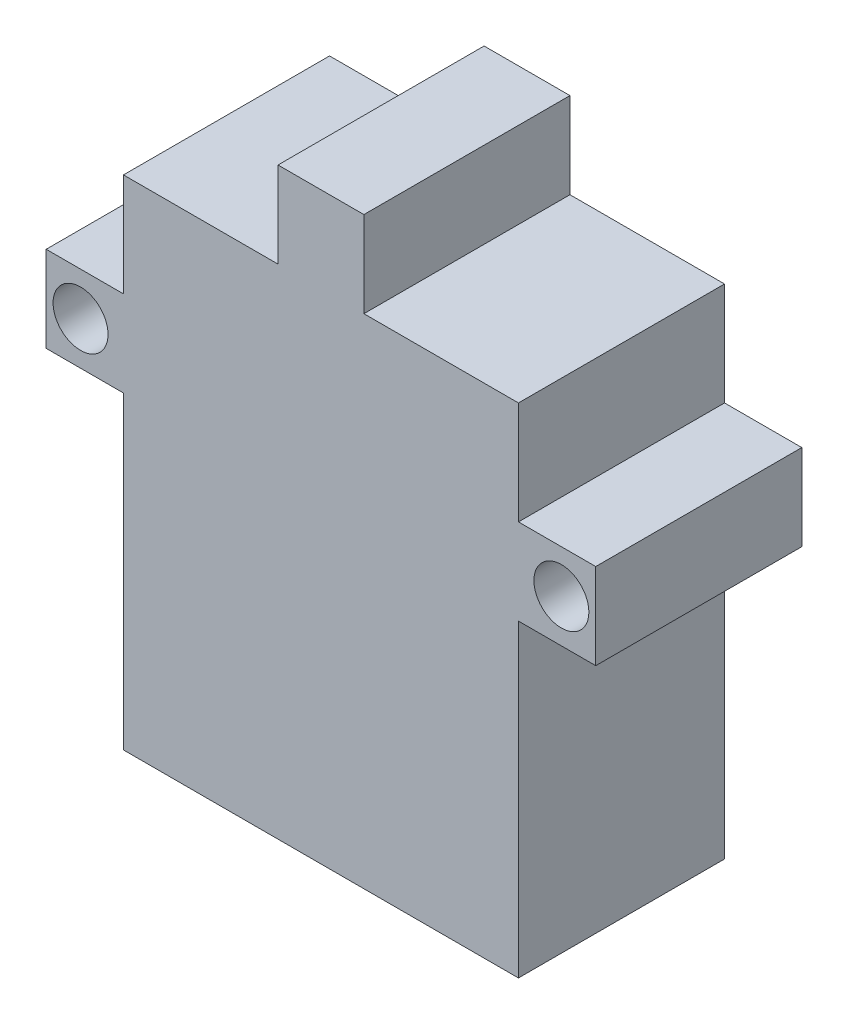
ISO-10303-21;
HEADER;
FILE_DESCRIPTION(('STEP AP214'),'2;1');
FILE_NAME('part.step','',(''),(''),'','','');
FILE_SCHEMA(('AUTOMOTIVE_DESIGN { 1 0 10303 214 1 1 1 1 }'));
ENDSEC;
DATA;
#1=APPLICATION_CONTEXT('core data for automotive mechanical design processes');
#2=APPLICATION_PROTOCOL_DEFINITION('international standard','automotive_design',2000,#1);
#3=PRODUCT_CONTEXT('',#1,'mechanical');
#4=PRODUCT('Part','Part','',(#3));
#5=PRODUCT_RELATED_PRODUCT_CATEGORY('part','',(#4));
#6=PRODUCT_DEFINITION_FORMATION('','',#4);
#7=PRODUCT_DEFINITION_CONTEXT('part definition',#1,'design');
#8=PRODUCT_DEFINITION('design','',#6,#7);
#9=PRODUCT_DEFINITION_SHAPE('','',#8);
#10=(LENGTH_UNIT() NAMED_UNIT(*) SI_UNIT(.MILLI.,.METRE.));
#11=(NAMED_UNIT(*) PLANE_ANGLE_UNIT() SI_UNIT($,.RADIAN.));
#12=(NAMED_UNIT(*) SI_UNIT($,.STERADIAN.) SOLID_ANGLE_UNIT());
#13=UNCERTAINTY_MEASURE_WITH_UNIT(LENGTH_MEASURE(1.E-05),#10,'distance_accuracy_value','');
#14=(GEOMETRIC_REPRESENTATION_CONTEXT(3) GLOBAL_UNCERTAINTY_ASSIGNED_CONTEXT((#13)) GLOBAL_UNIT_ASSIGNED_CONTEXT((#10,
#11,#12)) REPRESENTATION_CONTEXT('',''));
#15=CARTESIAN_POINT('',(0.,0.,0.));
#16=DIRECTION('',(0.,0.,1.));
#17=DIRECTION('',(1.,0.,0.));
#18=AXIS2_PLACEMENT_3D('',#15,#16,#17);
#19=CARTESIAN_POINT('',(0.,0.,6.));
#20=DIRECTION('',(0.,0.,1.));
#21=DIRECTION('',(1.,0.,0.));
#22=AXIS2_PLACEMENT_3D('',#19,#20,#21);
#23=PLANE('',#22);
#24=CARTESIAN_POINT('',(14.,20.5,6.));
#25=DIRECTION('',(0.,0.,1.));
#26=DIRECTION('',(1.,0.,0.));
#27=AXIS2_PLACEMENT_3D('',#24,#25,#26);
#28=CIRCLE('',#27,1.6);
#29=CARTESIAN_POINT('',(15.6,20.5,6.));
#30=VERTEX_POINT('',#29);
#31=EDGE_CURVE('E197',#30,#30,#28,.T.);
#32=ORIENTED_EDGE('',*,*,#31,.F.);
#33=EDGE_LOOP('',(#32));
#34=FACE_BOUND('',#33,.T.);
#35=DIRECTION('',(1.,0.,0.));
#36=VECTOR('',#35,1.);
#37=CARTESIAN_POINT('',(-11.5,0.,6.));
#38=LINE('',#37,#36);
#39=CARTESIAN_POINT('',(-11.5,0.,6.));
#40=VERTEX_POINT('',#39);
#41=CARTESIAN_POINT('',(11.5,0.,6.));
#42=VERTEX_POINT('',#41);
#43=EDGE_CURVE('E221',#40,#42,#38,.T.);
#44=ORIENTED_EDGE('',*,*,#43,.T.);
#45=DIRECTION('',(0.,1.,0.));
#46=VECTOR('',#45,1.);
#47=CARTESIAN_POINT('',(11.5,0.,6.));
#48=LINE('',#47,#46);
#49=CARTESIAN_POINT('',(11.5,18.,6.));
#50=VERTEX_POINT('',#49);
#51=EDGE_CURVE('E135',#42,#50,#48,.T.);
#52=ORIENTED_EDGE('',*,*,#51,.T.);
#53=DIRECTION('',(1.,0.,0.));
#54=VECTOR('',#53,1.);
#55=CARTESIAN_POINT('',(11.5,18.,6.));
#56=LINE('',#55,#54);
#57=CARTESIAN_POINT('',(16.,18.,6.));
#58=VERTEX_POINT('',#57);
#59=EDGE_CURVE('E263',#50,#58,#56,.T.);
#60=ORIENTED_EDGE('',*,*,#59,.T.);
#61=DIRECTION('',(0.,1.,0.));
#62=VECTOR('',#61,1.);
#63=CARTESIAN_POINT('',(16.,18.,6.));
#64=LINE('',#63,#62);
#65=CARTESIAN_POINT('',(16.,23.,6.));
#66=VERTEX_POINT('',#65);
#67=EDGE_CURVE('E285',#58,#66,#64,.T.);
#68=ORIENTED_EDGE('',*,*,#67,.T.);
#69=DIRECTION('',(-1.,0.,0.));
#70=VECTOR('',#69,1.);
#71=CARTESIAN_POINT('',(16.,23.,6.));
#72=LINE('',#71,#70);
#73=CARTESIAN_POINT('',(11.5,23.,6.));
#74=VERTEX_POINT('',#73);
#75=EDGE_CURVE('E276',#66,#74,#72,.T.);
#76=ORIENTED_EDGE('',*,*,#75,.T.);
#77=DIRECTION('',(0.,1.,0.));
#78=VECTOR('',#77,1.);
#79=CARTESIAN_POINT('',(11.5,23.,6.));
#80=LINE('',#79,#78);
#81=CARTESIAN_POINT('',(11.5,29.,6.));
#82=VERTEX_POINT('',#81);
#83=EDGE_CURVE('E283',#74,#82,#80,.T.);
#84=ORIENTED_EDGE('',*,*,#83,.T.);
#85=DIRECTION('',(-1.,0.,0.));
#86=VECTOR('',#85,1.);
#87=CARTESIAN_POINT('',(11.5,29.,6.));
#88=LINE('',#87,#86);
#89=CARTESIAN_POINT('',(2.5,29.,6.));
#90=VERTEX_POINT('',#89);
#91=EDGE_CURVE('E284',#82,#90,#88,.T.);
#92=ORIENTED_EDGE('',*,*,#91,.T.);
#93=DIRECTION('',(0.,1.,0.));
#94=VECTOR('',#93,1.);
#95=CARTESIAN_POINT('',(2.5,29.,6.));
#96=LINE('',#95,#94);
#97=CARTESIAN_POINT('',(2.5,34.,6.));
#98=VERTEX_POINT('',#97);
#99=EDGE_CURVE('E286',#90,#98,#96,.T.);
#100=ORIENTED_EDGE('',*,*,#99,.T.);
#101=DIRECTION('',(-1.,0.,0.));
#102=VECTOR('',#101,1.);
#103=CARTESIAN_POINT('',(2.5,34.,6.));
#104=LINE('',#103,#102);
#105=CARTESIAN_POINT('',(-2.5,34.,6.));
#106=VERTEX_POINT('',#105);
#107=EDGE_CURVE('E295',#98,#106,#104,.T.);
#108=ORIENTED_EDGE('',*,*,#107,.T.);
#109=DIRECTION('',(0.,-1.,0.));
#110=VECTOR('',#109,1.);
#111=CARTESIAN_POINT('',(-2.5,34.,6.));
#112=LINE('',#111,#110);
#113=CARTESIAN_POINT('',(-2.5,29.,6.));
#114=VERTEX_POINT('',#113);
#115=EDGE_CURVE('E294',#106,#114,#112,.T.);
#116=ORIENTED_EDGE('',*,*,#115,.T.);
#117=DIRECTION('',(-1.,0.,0.));
#118=VECTOR('',#117,1.);
#119=CARTESIAN_POINT('',(-2.5,29.,6.));
#120=LINE('',#119,#118);
#121=CARTESIAN_POINT('',(-11.5,29.,6.));
#122=VERTEX_POINT('',#121);
#123=EDGE_CURVE('E298',#114,#122,#120,.T.);
#124=ORIENTED_EDGE('',*,*,#123,.T.);
#125=DIRECTION('',(0.,-1.,0.));
#126=VECTOR('',#125,1.);
#127=CARTESIAN_POINT('',(-11.5,29.,6.));
#128=LINE('',#127,#126);
#129=CARTESIAN_POINT('',(-11.5,23.,6.));
#130=VERTEX_POINT('',#129);
#131=EDGE_CURVE('E296',#122,#130,#128,.T.);
#132=ORIENTED_EDGE('',*,*,#131,.T.);
#133=DIRECTION('',(-1.,0.,0.));
#134=VECTOR('',#133,1.);
#135=CARTESIAN_POINT('',(-11.5,23.,6.));
#136=LINE('',#135,#134);
#137=CARTESIAN_POINT('',(-16.,23.,6.));
#138=VERTEX_POINT('',#137);
#139=EDGE_CURVE('E172',#130,#138,#136,.T.);
#140=ORIENTED_EDGE('',*,*,#139,.T.);
#141=DIRECTION('',(0.,-1.,0.));
#142=VECTOR('',#141,1.);
#143=CARTESIAN_POINT('',(-16.,23.,6.));
#144=LINE('',#143,#142);
#145=CARTESIAN_POINT('',(-16.,18.,6.));
#146=VERTEX_POINT('',#145);
#147=EDGE_CURVE('E166',#138,#146,#144,.T.);
#148=ORIENTED_EDGE('',*,*,#147,.T.);
#149=DIRECTION('',(1.,0.,0.));
#150=VECTOR('',#149,1.);
#151=CARTESIAN_POINT('',(-16.,18.,6.));
#152=LINE('',#151,#150);
#153=CARTESIAN_POINT('',(-11.5,18.,6.));
#154=VERTEX_POINT('',#153);
#155=EDGE_CURVE('E171',#146,#154,#152,.T.);
#156=ORIENTED_EDGE('',*,*,#155,.T.);
#157=DIRECTION('',(0.,-1.,0.));
#158=VECTOR('',#157,1.);
#159=CARTESIAN_POINT('',(-11.5,18.,6.));
#160=LINE('',#159,#158);
#161=EDGE_CURVE('E62',#154,#40,#160,.T.);
#162=ORIENTED_EDGE('',*,*,#161,.T.);
#163=EDGE_LOOP('',(#44,#52,#60,#68,#76,#84,#92,#100,#108,#116,#124,#132,#140,#148,#156,#162));
#164=FACE_BOUND('',#163,.T.);
#165=CARTESIAN_POINT('',(-14.,20.5,6.));
#166=DIRECTION('',(0.,0.,1.));
#167=DIRECTION('',(1.,0.,0.));
#168=AXIS2_PLACEMENT_3D('',#165,#166,#167);
#169=CIRCLE('',#168,1.6);
#170=CARTESIAN_POINT('',(-12.4,20.5,6.));
#171=VERTEX_POINT('',#170);
#172=EDGE_CURVE('E374',#171,#171,#169,.T.);
#173=ORIENTED_EDGE('',*,*,#172,.F.);
#174=EDGE_LOOP('',(#173));
#175=FACE_BOUND('',#174,.T.);
#176=ADVANCED_FACE('F50',(#34,#164,#175),#23,.T.);
#177=CARTESIAN_POINT('',(0.,0.,-6.));
#178=DIRECTION('',(0.,0.,1.));
#179=DIRECTION('',(1.,0.,0.));
#180=AXIS2_PLACEMENT_3D('',#177,#178,#179);
#181=PLANE('',#180);
#182=DIRECTION('',(1.,0.,0.));
#183=VECTOR('',#182,1.);
#184=CARTESIAN_POINT('',(-11.5,0.,-6.));
#185=LINE('',#184,#183);
#186=CARTESIAN_POINT('',(-11.5,0.,-6.));
#187=VERTEX_POINT('',#186);
#188=CARTESIAN_POINT('',(11.5,0.,-6.));
#189=VERTEX_POINT('',#188);
#190=EDGE_CURVE('E193',#187,#189,#185,.T.);
#191=ORIENTED_EDGE('',*,*,#190,.F.);
#192=DIRECTION('',(0.,-1.,0.));
#193=VECTOR('',#192,1.);
#194=CARTESIAN_POINT('',(-11.5,18.,-6.));
#195=LINE('',#194,#193);
#196=CARTESIAN_POINT('',(-11.5,18.,-6.));
#197=VERTEX_POINT('',#196);
#198=EDGE_CURVE('E124',#197,#187,#195,.T.);
#199=ORIENTED_EDGE('',*,*,#198,.F.);
#200=DIRECTION('',(1.,0.,0.));
#201=VECTOR('',#200,1.);
#202=CARTESIAN_POINT('',(-16.,18.,-6.));
#203=LINE('',#202,#201);
#204=CARTESIAN_POINT('',(-16.,18.,-6.));
#205=VERTEX_POINT('',#204);
#206=EDGE_CURVE('E116',#205,#197,#203,.T.);
#207=ORIENTED_EDGE('',*,*,#206,.F.);
#208=DIRECTION('',(0.,-1.,0.));
#209=VECTOR('',#208,1.);
#210=CARTESIAN_POINT('',(-16.,23.,-6.));
#211=LINE('',#210,#209);
#212=CARTESIAN_POINT('',(-16.,23.,-6.));
#213=VERTEX_POINT('',#212);
#214=EDGE_CURVE('E181',#213,#205,#211,.T.);
#215=ORIENTED_EDGE('',*,*,#214,.F.);
#216=DIRECTION('',(-1.,0.,0.));
#217=VECTOR('',#216,1.);
#218=CARTESIAN_POINT('',(-11.5,23.,-6.));
#219=LINE('',#218,#217);
#220=CARTESIAN_POINT('',(-11.5,23.,-6.));
#221=VERTEX_POINT('',#220);
#222=EDGE_CURVE('E218',#221,#213,#219,.T.);
#223=ORIENTED_EDGE('',*,*,#222,.F.);
#224=DIRECTION('',(0.,-1.,0.));
#225=VECTOR('',#224,1.);
#226=CARTESIAN_POINT('',(-11.5,29.,-6.));
#227=LINE('',#226,#225);
#228=CARTESIAN_POINT('',(-11.5,29.,-6.));
#229=VERTEX_POINT('',#228);
#230=EDGE_CURVE('E220',#229,#221,#227,.T.);
#231=ORIENTED_EDGE('',*,*,#230,.F.);
#232=DIRECTION('',(-1.,0.,0.));
#233=VECTOR('',#232,1.);
#234=CARTESIAN_POINT('',(-2.5,29.,-6.));
#235=LINE('',#234,#233);
#236=CARTESIAN_POINT('',(-2.5,29.,-6.));
#237=VERTEX_POINT('',#236);
#238=EDGE_CURVE('E214',#237,#229,#235,.T.);
#239=ORIENTED_EDGE('',*,*,#238,.F.);
#240=DIRECTION('',(0.,-1.,0.));
#241=VECTOR('',#240,1.);
#242=CARTESIAN_POINT('',(-2.5,34.,-6.));
#243=LINE('',#242,#241);
#244=CARTESIAN_POINT('',(-2.5,34.,-6.));
#245=VERTEX_POINT('',#244);
#246=EDGE_CURVE('E213',#245,#237,#243,.T.);
#247=ORIENTED_EDGE('',*,*,#246,.F.);
#248=DIRECTION('',(-1.,0.,0.));
#249=VECTOR('',#248,1.);
#250=CARTESIAN_POINT('',(2.5,34.,-6.));
#251=LINE('',#250,#249);
#252=CARTESIAN_POINT('',(2.5,34.,-6.));
#253=VERTEX_POINT('',#252);
#254=EDGE_CURVE('E211',#253,#245,#251,.T.);
#255=ORIENTED_EDGE('',*,*,#254,.F.);
#256=DIRECTION('',(0.,1.,0.));
#257=VECTOR('',#256,1.);
#258=CARTESIAN_POINT('',(2.5,29.,-6.));
#259=LINE('',#258,#257);
#260=CARTESIAN_POINT('',(2.5,29.,-6.));
#261=VERTEX_POINT('',#260);
#262=EDGE_CURVE('E207',#261,#253,#259,.T.);
#263=ORIENTED_EDGE('',*,*,#262,.F.);
#264=DIRECTION('',(-1.,0.,0.));
#265=VECTOR('',#264,1.);
#266=CARTESIAN_POINT('',(11.5,29.,-6.));
#267=LINE('',#266,#265);
#268=CARTESIAN_POINT('',(11.5,29.,-6.));
#269=VERTEX_POINT('',#268);
#270=EDGE_CURVE('E210',#269,#261,#267,.T.);
#271=ORIENTED_EDGE('',*,*,#270,.F.);
#272=DIRECTION('',(0.,1.,0.));
#273=VECTOR('',#272,1.);
#274=CARTESIAN_POINT('',(11.5,23.,-6.));
#275=LINE('',#274,#273);
#276=CARTESIAN_POINT('',(11.5,23.,-6.));
#277=VERTEX_POINT('',#276);
#278=EDGE_CURVE('E202',#277,#269,#275,.T.);
#279=ORIENTED_EDGE('',*,*,#278,.F.);
#280=DIRECTION('',(-1.,0.,0.));
#281=VECTOR('',#280,1.);
#282=CARTESIAN_POINT('',(16.,23.,-6.));
#283=LINE('',#282,#281);
#284=CARTESIAN_POINT('',(16.,23.,-6.));
#285=VERTEX_POINT('',#284);
#286=EDGE_CURVE('E201',#285,#277,#283,.T.);
#287=ORIENTED_EDGE('',*,*,#286,.F.);
#288=DIRECTION('',(0.,1.,0.));
#289=VECTOR('',#288,1.);
#290=CARTESIAN_POINT('',(16.,18.,-6.));
#291=LINE('',#290,#289);
#292=CARTESIAN_POINT('',(16.,18.,-6.));
#293=VERTEX_POINT('',#292);
#294=EDGE_CURVE('E203',#293,#285,#291,.T.);
#295=ORIENTED_EDGE('',*,*,#294,.F.);
#296=DIRECTION('',(1.,0.,0.));
#297=VECTOR('',#296,1.);
#298=CARTESIAN_POINT('',(11.5,18.,-6.));
#299=LINE('',#298,#297);
#300=CARTESIAN_POINT('',(11.5,18.,-6.));
#301=VERTEX_POINT('',#300);
#302=EDGE_CURVE('E200',#301,#293,#299,.T.);
#303=ORIENTED_EDGE('',*,*,#302,.F.);
#304=DIRECTION('',(0.,1.,0.));
#305=VECTOR('',#304,1.);
#306=CARTESIAN_POINT('',(11.5,0.,-6.));
#307=LINE('',#306,#305);
#308=EDGE_CURVE('E198',#189,#301,#307,.T.);
#309=ORIENTED_EDGE('',*,*,#308,.F.);
#310=EDGE_LOOP('',(#191,#199,#207,#215,#223,#231,#239,#247,#255,#263,#271,#279,#287,#295,#303,#309));
#311=FACE_BOUND('',#310,.T.);
#312=CARTESIAN_POINT('',(14.,20.5,-6.));
#313=DIRECTION('',(0.,0.,1.));
#314=DIRECTION('',(1.,0.,0.));
#315=AXIS2_PLACEMENT_3D('',#312,#313,#314);
#316=CIRCLE('',#315,1.6);
#317=CARTESIAN_POINT('',(15.6,20.5,-6.));
#318=VERTEX_POINT('',#317);
#319=EDGE_CURVE('E381',#318,#318,#316,.T.);
#320=ORIENTED_EDGE('',*,*,#319,.T.);
#321=EDGE_LOOP('',(#320));
#322=FACE_BOUND('',#321,.T.);
#323=CARTESIAN_POINT('',(-14.,20.5,-6.));
#324=DIRECTION('',(0.,0.,1.));
#325=DIRECTION('',(1.,0.,0.));
#326=AXIS2_PLACEMENT_3D('',#323,#324,#325);
#327=CIRCLE('',#326,1.6);
#328=CARTESIAN_POINT('',(-12.4,20.5,-6.));
#329=VERTEX_POINT('',#328);
#330=EDGE_CURVE('E378',#329,#329,#327,.T.);
#331=ORIENTED_EDGE('',*,*,#330,.T.);
#332=EDGE_LOOP('',(#331));
#333=FACE_BOUND('',#332,.T.);
#334=ADVANCED_FACE('F270',(#311,#322,#333),#181,.F.);
#335=CARTESIAN_POINT('',(-11.5,0.,6.));
#336=DIRECTION('',(0.,1.,0.));
#337=DIRECTION('',(0.,0.,1.));
#338=AXIS2_PLACEMENT_3D('',#335,#336,#337);
#339=PLANE('',#338);
#340=ORIENTED_EDGE('',*,*,#190,.T.);
#341=DIRECTION('',(0.,0.,-1.));
#342=VECTOR('',#341,1.);
#343=CARTESIAN_POINT('',(11.5,0.,6.));
#344=LINE('',#343,#342);
#345=EDGE_CURVE('E11',#42,#189,#344,.T.);
#346=ORIENTED_EDGE('',*,*,#345,.F.);
#347=ORIENTED_EDGE('',*,*,#43,.F.);
#348=DIRECTION('',(0.,0.,-1.));
#349=VECTOR('',#348,1.);
#350=CARTESIAN_POINT('',(-11.5,0.,6.));
#351=LINE('',#350,#349);
#352=EDGE_CURVE('E189',#40,#187,#351,.T.);
#353=ORIENTED_EDGE('',*,*,#352,.T.);
#354=EDGE_LOOP('',(#340,#346,#347,#353));
#355=FACE_BOUND('',#354,.T.);
#356=ADVANCED_FACE('F49',(#355),#339,.F.);
#357=CARTESIAN_POINT('',(11.5,0.,6.));
#358=DIRECTION('',(-1.,0.,0.));
#359=DIRECTION('',(0.,0.,1.));
#360=AXIS2_PLACEMENT_3D('',#357,#358,#359);
#361=PLANE('',#360);
#362=ORIENTED_EDGE('',*,*,#308,.T.);
#363=DIRECTION('',(0.,0.,-1.));
#364=VECTOR('',#363,1.);
#365=CARTESIAN_POINT('',(11.5,18.,6.));
#366=LINE('',#365,#364);
#367=EDGE_CURVE('E60',#50,#301,#366,.T.);
#368=ORIENTED_EDGE('',*,*,#367,.F.);
#369=ORIENTED_EDGE('',*,*,#51,.F.);
#370=ORIENTED_EDGE('',*,*,#345,.T.);
#371=EDGE_LOOP('',(#362,#368,#369,#370));
#372=FACE_BOUND('',#371,.T.);
#373=ADVANCED_FACE('F340',(#372),#361,.F.);
#374=CARTESIAN_POINT('',(11.5,18.,6.));
#375=DIRECTION('',(0.,1.,0.));
#376=DIRECTION('',(0.,0.,1.));
#377=AXIS2_PLACEMENT_3D('',#374,#375,#376);
#378=PLANE('',#377);
#379=ORIENTED_EDGE('',*,*,#302,.T.);
#380=DIRECTION('',(0.,0.,-1.));
#381=VECTOR('',#380,1.);
#382=CARTESIAN_POINT('',(16.,18.,6.));
#383=LINE('',#382,#381);
#384=EDGE_CURVE('E254',#58,#293,#383,.T.);
#385=ORIENTED_EDGE('',*,*,#384,.F.);
#386=ORIENTED_EDGE('',*,*,#59,.F.);
#387=ORIENTED_EDGE('',*,*,#367,.T.);
#388=EDGE_LOOP('',(#379,#385,#386,#387));
#389=FACE_BOUND('',#388,.T.);
#390=ADVANCED_FACE('F261',(#389),#378,.F.);
#391=CARTESIAN_POINT('',(16.,18.,6.));
#392=DIRECTION('',(-1.,0.,0.));
#393=DIRECTION('',(0.,0.,1.));
#394=AXIS2_PLACEMENT_3D('',#391,#392,#393);
#395=PLANE('',#394);
#396=ORIENTED_EDGE('',*,*,#294,.T.);
#397=DIRECTION('',(0.,0.,-1.));
#398=VECTOR('',#397,1.);
#399=CARTESIAN_POINT('',(16.,23.,6.));
#400=LINE('',#399,#398);
#401=EDGE_CURVE('E252',#66,#285,#400,.T.);
#402=ORIENTED_EDGE('',*,*,#401,.F.);
#403=ORIENTED_EDGE('',*,*,#67,.F.);
#404=ORIENTED_EDGE('',*,*,#384,.T.);
#405=EDGE_LOOP('',(#396,#402,#403,#404));
#406=FACE_BOUND('',#405,.T.);
#407=ADVANCED_FACE('F272',(#406),#395,.F.);
#408=CARTESIAN_POINT('',(16.,23.,6.));
#409=DIRECTION('',(0.,-1.,0.));
#410=DIRECTION('',(0.,0.,-1.));
#411=AXIS2_PLACEMENT_3D('',#408,#409,#410);
#412=PLANE('',#411);
#413=ORIENTED_EDGE('',*,*,#286,.T.);
#414=DIRECTION('',(0.,0.,-1.));
#415=VECTOR('',#414,1.);
#416=CARTESIAN_POINT('',(11.5,23.,6.));
#417=LINE('',#416,#415);
#418=EDGE_CURVE('E249',#74,#277,#417,.T.);
#419=ORIENTED_EDGE('',*,*,#418,.F.);
#420=ORIENTED_EDGE('',*,*,#75,.F.);
#421=ORIENTED_EDGE('',*,*,#401,.T.);
#422=EDGE_LOOP('',(#413,#419,#420,#421));
#423=FACE_BOUND('',#422,.T.);
#424=ADVANCED_FACE('F280',(#423),#412,.F.);
#425=CARTESIAN_POINT('',(11.5,23.,6.));
#426=DIRECTION('',(-1.,0.,0.));
#427=DIRECTION('',(0.,0.,1.));
#428=AXIS2_PLACEMENT_3D('',#425,#426,#427);
#429=PLANE('',#428);
#430=ORIENTED_EDGE('',*,*,#278,.T.);
#431=DIRECTION('',(0.,0.,-1.));
#432=VECTOR('',#431,1.);
#433=CARTESIAN_POINT('',(11.5,29.,6.));
#434=LINE('',#433,#432);
#435=EDGE_CURVE('E247',#82,#269,#434,.T.);
#436=ORIENTED_EDGE('',*,*,#435,.F.);
#437=ORIENTED_EDGE('',*,*,#83,.F.);
#438=ORIENTED_EDGE('',*,*,#418,.T.);
#439=EDGE_LOOP('',(#430,#436,#437,#438));
#440=FACE_BOUND('',#439,.T.);
#441=ADVANCED_FACE('F347',(#440),#429,.F.);
#442=CARTESIAN_POINT('',(11.5,29.,6.));
#443=DIRECTION('',(0.,-1.,0.));
#444=DIRECTION('',(0.,0.,-1.));
#445=AXIS2_PLACEMENT_3D('',#442,#443,#444);
#446=PLANE('',#445);
#447=ORIENTED_EDGE('',*,*,#270,.T.);
#448=DIRECTION('',(0.,0.,-1.));
#449=VECTOR('',#448,1.);
#450=CARTESIAN_POINT('',(2.5,29.,6.));
#451=LINE('',#450,#449);
#452=EDGE_CURVE('E241',#90,#261,#451,.T.);
#453=ORIENTED_EDGE('',*,*,#452,.F.);
#454=ORIENTED_EDGE('',*,*,#91,.F.);
#455=ORIENTED_EDGE('',*,*,#435,.T.);
#456=EDGE_LOOP('',(#447,#453,#454,#455));
#457=FACE_BOUND('',#456,.T.);
#458=ADVANCED_FACE('F349',(#457),#446,.F.);
#459=CARTESIAN_POINT('',(2.5,29.,6.));
#460=DIRECTION('',(-1.,0.,0.));
#461=DIRECTION('',(0.,0.,1.));
#462=AXIS2_PLACEMENT_3D('',#459,#460,#461);
#463=PLANE('',#462);
#464=ORIENTED_EDGE('',*,*,#262,.T.);
#465=DIRECTION('',(0.,0.,-1.));
#466=VECTOR('',#465,1.);
#467=CARTESIAN_POINT('',(2.5,34.,6.));
#468=LINE('',#467,#466);
#469=EDGE_CURVE('E238',#98,#253,#468,.T.);
#470=ORIENTED_EDGE('',*,*,#469,.F.);
#471=ORIENTED_EDGE('',*,*,#99,.F.);
#472=ORIENTED_EDGE('',*,*,#452,.T.);
#473=EDGE_LOOP('',(#464,#470,#471,#472));
#474=FACE_BOUND('',#473,.T.);
#475=ADVANCED_FACE('F355',(#474),#463,.F.);
#476=CARTESIAN_POINT('',(2.5,34.,6.));
#477=DIRECTION('',(0.,-1.,0.));
#478=DIRECTION('',(0.,0.,-1.));
#479=AXIS2_PLACEMENT_3D('',#476,#477,#478);
#480=PLANE('',#479);
#481=ORIENTED_EDGE('',*,*,#254,.T.);
#482=DIRECTION('',(0.,0.,-1.));
#483=VECTOR('',#482,1.);
#484=CARTESIAN_POINT('',(-2.5,34.,6.));
#485=LINE('',#484,#483);
#486=EDGE_CURVE('E240',#106,#245,#485,.T.);
#487=ORIENTED_EDGE('',*,*,#486,.F.);
#488=ORIENTED_EDGE('',*,*,#107,.F.);
#489=ORIENTED_EDGE('',*,*,#469,.T.);
#490=EDGE_LOOP('',(#481,#487,#488,#489));
#491=FACE_BOUND('',#490,.T.);
#492=ADVANCED_FACE('F352',(#491),#480,.F.);
#493=CARTESIAN_POINT('',(-2.5,34.,6.));
#494=DIRECTION('',(1.,0.,0.));
#495=DIRECTION('',(0.,0.,-1.));
#496=AXIS2_PLACEMENT_3D('',#493,#494,#495);
#497=PLANE('',#496);
#498=ORIENTED_EDGE('',*,*,#246,.T.);
#499=DIRECTION('',(0.,0.,-1.));
#500=VECTOR('',#499,1.);
#501=CARTESIAN_POINT('',(-2.5,29.,6.));
#502=LINE('',#501,#500);
#503=EDGE_CURVE('E234',#114,#237,#502,.T.);
#504=ORIENTED_EDGE('',*,*,#503,.F.);
#505=ORIENTED_EDGE('',*,*,#115,.F.);
#506=ORIENTED_EDGE('',*,*,#486,.T.);
#507=EDGE_LOOP('',(#498,#504,#505,#506));
#508=FACE_BOUND('',#507,.T.);
#509=ADVANCED_FACE('F358',(#508),#497,.F.);
#510=CARTESIAN_POINT('',(-2.5,29.,6.));
#511=DIRECTION('',(0.,-1.,0.));
#512=DIRECTION('',(0.,0.,-1.));
#513=AXIS2_PLACEMENT_3D('',#510,#511,#512);
#514=PLANE('',#513);
#515=ORIENTED_EDGE('',*,*,#238,.T.);
#516=DIRECTION('',(0.,0.,-1.));
#517=VECTOR('',#516,1.);
#518=CARTESIAN_POINT('',(-11.5,29.,6.));
#519=LINE('',#518,#517);
#520=EDGE_CURVE('E232',#122,#229,#519,.T.);
#521=ORIENTED_EDGE('',*,*,#520,.F.);
#522=ORIENTED_EDGE('',*,*,#123,.F.);
#523=ORIENTED_EDGE('',*,*,#503,.T.);
#524=EDGE_LOOP('',(#515,#521,#522,#523));
#525=FACE_BOUND('',#524,.T.);
#526=ADVANCED_FACE('F363',(#525),#514,.F.);
#527=CARTESIAN_POINT('',(-11.5,29.,6.));
#528=DIRECTION('',(1.,0.,0.));
#529=DIRECTION('',(0.,0.,-1.));
#530=AXIS2_PLACEMENT_3D('',#527,#528,#529);
#531=PLANE('',#530);
#532=ORIENTED_EDGE('',*,*,#230,.T.);
#533=DIRECTION('',(0.,0.,-1.));
#534=VECTOR('',#533,1.);
#535=CARTESIAN_POINT('',(-11.5,23.,6.));
#536=LINE('',#535,#534);
#537=EDGE_CURVE('E226',#130,#221,#536,.T.);
#538=ORIENTED_EDGE('',*,*,#537,.F.);
#539=ORIENTED_EDGE('',*,*,#131,.F.);
#540=ORIENTED_EDGE('',*,*,#520,.T.);
#541=EDGE_LOOP('',(#532,#538,#539,#540));
#542=FACE_BOUND('',#541,.T.);
#543=ADVANCED_FACE('F304',(#542),#531,.F.);
#544=CARTESIAN_POINT('',(-11.5,23.,6.));
#545=DIRECTION('',(0.,-1.,0.));
#546=DIRECTION('',(0.,0.,-1.));
#547=AXIS2_PLACEMENT_3D('',#544,#545,#546);
#548=PLANE('',#547);
#549=ORIENTED_EDGE('',*,*,#222,.T.);
#550=DIRECTION('',(0.,0.,-1.));
#551=VECTOR('',#550,1.);
#552=CARTESIAN_POINT('',(-16.,23.,6.));
#553=LINE('',#552,#551);
#554=EDGE_CURVE('E184',#138,#213,#553,.T.);
#555=ORIENTED_EDGE('',*,*,#554,.F.);
#556=ORIENTED_EDGE('',*,*,#139,.F.);
#557=ORIENTED_EDGE('',*,*,#537,.T.);
#558=EDGE_LOOP('',(#549,#555,#556,#557));
#559=FACE_BOUND('',#558,.T.);
#560=ADVANCED_FACE('F306',(#559),#548,.F.);
#561=CARTESIAN_POINT('',(-16.,23.,6.));
#562=DIRECTION('',(1.,0.,0.));
#563=DIRECTION('',(0.,0.,-1.));
#564=AXIS2_PLACEMENT_3D('',#561,#562,#563);
#565=PLANE('',#564);
#566=ORIENTED_EDGE('',*,*,#214,.T.);
#567=DIRECTION('',(0.,0.,-1.));
#568=VECTOR('',#567,1.);
#569=CARTESIAN_POINT('',(-16.,18.,6.));
#570=LINE('',#569,#568);
#571=EDGE_CURVE('E176',#146,#205,#570,.T.);
#572=ORIENTED_EDGE('',*,*,#571,.F.);
#573=ORIENTED_EDGE('',*,*,#147,.F.);
#574=ORIENTED_EDGE('',*,*,#554,.T.);
#575=EDGE_LOOP('',(#566,#572,#573,#574));
#576=FACE_BOUND('',#575,.T.);
#577=ADVANCED_FACE('F182',(#576),#565,.F.);
#578=CARTESIAN_POINT('',(-16.,18.,6.));
#579=DIRECTION('',(0.,1.,0.));
#580=DIRECTION('',(0.,0.,1.));
#581=AXIS2_PLACEMENT_3D('',#578,#579,#580);
#582=PLANE('',#581);
#583=ORIENTED_EDGE('',*,*,#206,.T.);
#584=DIRECTION('',(0.,0.,-1.));
#585=VECTOR('',#584,1.);
#586=CARTESIAN_POINT('',(-11.5,18.,6.));
#587=LINE('',#586,#585);
#588=EDGE_CURVE('E183',#154,#197,#587,.T.);
#589=ORIENTED_EDGE('',*,*,#588,.F.);
#590=ORIENTED_EDGE('',*,*,#155,.F.);
#591=ORIENTED_EDGE('',*,*,#571,.T.);
#592=EDGE_LOOP('',(#583,#589,#590,#591));
#593=FACE_BOUND('',#592,.T.);
#594=ADVANCED_FACE('F190',(#593),#582,.F.);
#595=CARTESIAN_POINT('',(-11.5,18.,6.));
#596=DIRECTION('',(1.,0.,0.));
#597=DIRECTION('',(0.,0.,-1.));
#598=AXIS2_PLACEMENT_3D('',#595,#596,#597);
#599=PLANE('',#598);
#600=ORIENTED_EDGE('',*,*,#198,.T.);
#601=ORIENTED_EDGE('',*,*,#352,.F.);
#602=ORIENTED_EDGE('',*,*,#161,.F.);
#603=ORIENTED_EDGE('',*,*,#588,.T.);
#604=EDGE_LOOP('',(#600,#601,#602,#603));
#605=FACE_BOUND('',#604,.T.);
#606=ADVANCED_FACE('F315',(#605),#599,.F.);
#607=CARTESIAN_POINT('',(14.,20.5,6.));
#608=DIRECTION('',(0.,0.,-1.));
#609=DIRECTION('',(-1.,0.,0.));
#610=AXIS2_PLACEMENT_3D('',#607,#608,#609);
#611=CYLINDRICAL_SURFACE('',#610,1.6);
#612=ORIENTED_EDGE('',*,*,#31,.T.);
#613=EDGE_LOOP('',(#612));
#614=FACE_BOUND('',#613,.T.);
#615=ORIENTED_EDGE('',*,*,#319,.F.);
#616=EDGE_LOOP('',(#615));
#617=FACE_BOUND('',#616,.T.);
#618=ADVANCED_FACE('F314',(#614,#617),#611,.F.);
#619=CARTESIAN_POINT('',(-14.,20.5,6.));
#620=DIRECTION('',(0.,0.,-1.));
#621=DIRECTION('',(-1.,0.,0.));
#622=AXIS2_PLACEMENT_3D('',#619,#620,#621);
#623=CYLINDRICAL_SURFACE('',#622,1.6);
#624=ORIENTED_EDGE('',*,*,#172,.T.);
#625=EDGE_LOOP('',(#624));
#626=FACE_BOUND('',#625,.T.);
#627=ORIENTED_EDGE('',*,*,#330,.F.);
#628=EDGE_LOOP('',(#627));
#629=FACE_BOUND('',#628,.T.);
#630=ADVANCED_FACE('F317',(#626,#629),#623,.F.);
#631=CLOSED_SHELL('',(#176,#334,#356,#373,#390,#407,#424,#441,#458,#475,#492,#509,#526,#543,
#560,#577,#594,#606,#618,#630));
#632=MANIFOLD_SOLID_BREP('B2',#631);
#633=ADVANCED_BREP_SHAPE_REPRESENTATION('',(#18,#632),#14);
#634=SHAPE_DEFINITION_REPRESENTATION(#9,#633);
ENDSEC;
END-ISO-10303-21;
